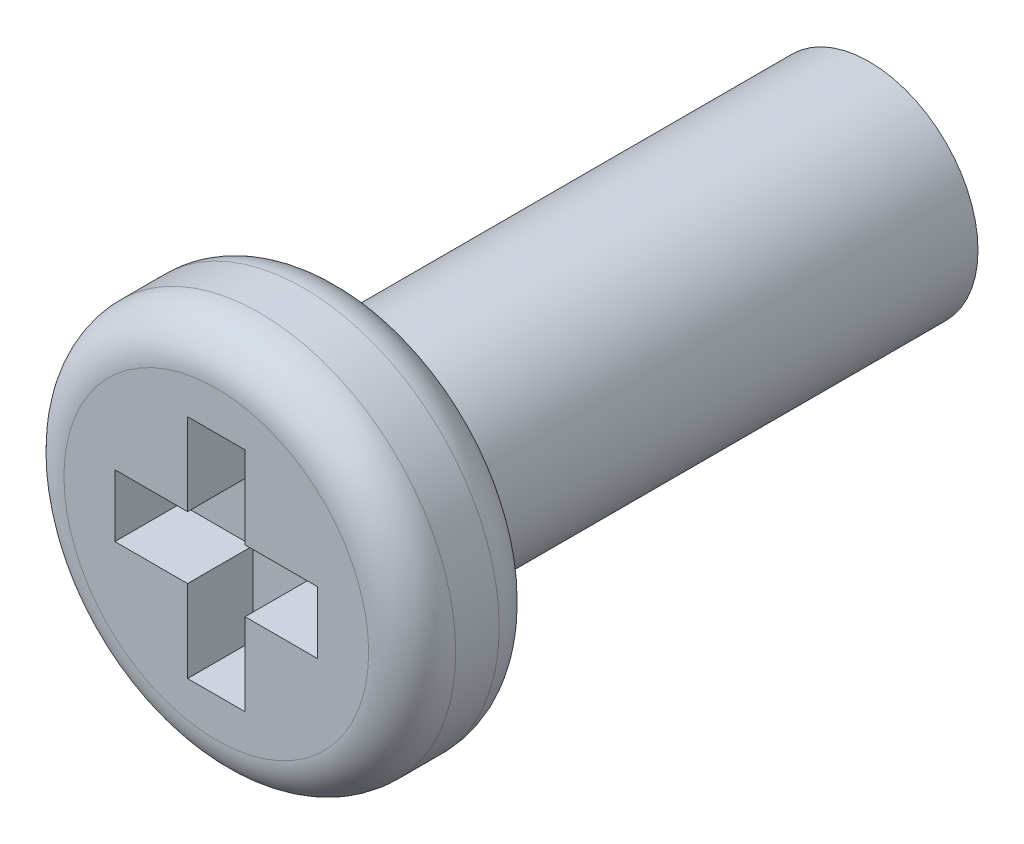
ISO-10303-21;
HEADER;
FILE_DESCRIPTION(('STEP AP214'),'2;1');
FILE_NAME('part.step','',(''),(''),'','','');
FILE_SCHEMA(('AUTOMOTIVE_DESIGN { 1 0 10303 214 1 1 1 1 }'));
ENDSEC;
DATA;
#1=APPLICATION_CONTEXT('core data for automotive mechanical design processes');
#2=APPLICATION_PROTOCOL_DEFINITION('international standard','automotive_design',2000,#1);
#3=PRODUCT_CONTEXT('',#1,'mechanical');
#4=PRODUCT('Part','Part','',(#3));
#5=PRODUCT_RELATED_PRODUCT_CATEGORY('part','',(#4));
#6=PRODUCT_DEFINITION_FORMATION('','',#4);
#7=PRODUCT_DEFINITION_CONTEXT('part definition',#1,'design');
#8=PRODUCT_DEFINITION('design','',#6,#7);
#9=PRODUCT_DEFINITION_SHAPE('','',#8);
#10=(LENGTH_UNIT() NAMED_UNIT(*) SI_UNIT(.MILLI.,.METRE.));
#11=(NAMED_UNIT(*) PLANE_ANGLE_UNIT() SI_UNIT($,.RADIAN.));
#12=(NAMED_UNIT(*) SI_UNIT($,.STERADIAN.) SOLID_ANGLE_UNIT());
#13=UNCERTAINTY_MEASURE_WITH_UNIT(LENGTH_MEASURE(1.E-05),#10,'distance_accuracy_value','');
#14=(GEOMETRIC_REPRESENTATION_CONTEXT(3) GLOBAL_UNCERTAINTY_ASSIGNED_CONTEXT((#13)) GLOBAL_UNIT_ASSIGNED_CONTEXT((#10,
#11,#12)) REPRESENTATION_CONTEXT('',''));
#15=CARTESIAN_POINT('',(0.,0.,0.));
#16=DIRECTION('',(0.,0.,1.));
#17=DIRECTION('',(1.,0.,0.));
#18=AXIS2_PLACEMENT_3D('',#15,#16,#17);
#19=CARTESIAN_POINT('',(-102.7186651452,-27.98826742742,65.3));
#20=DIRECTION('',(0.,0.,1.));
#21=DIRECTION('',(0.,1.,0.));
#22=AXIS2_PLACEMENT_3D('',#19,#20,#21);
#23=PLANE('',#22);
#24=DIRECTION('',(1.,0.,0.));
#25=VECTOR('',#24,1.);
#26=CARTESIAN_POINT('',(-106.6368651452,-25.99406742742,65.3));
#27=LINE('',#26,#25);
#28=CARTESIAN_POINT('',(-107.4718651452,-25.99406742742,65.3));
#29=VERTEX_POINT('',#28);
#30=CARTESIAN_POINT('',(-105.8018651452,-25.99406742742,65.3));
#31=VERTEX_POINT('',#30);
#32=EDGE_CURVE('E137',#29,#31,#27,.T.);
#33=ORIENTED_EDGE('',*,*,#32,.T.);
#34=DIRECTION('',(0.,-1.,0.));
#35=VECTOR('',#34,1.);
#36=CARTESIAN_POINT('',(-105.8018651452,-26.93906742742,65.3));
#37=LINE('',#36,#35);
#38=CARTESIAN_POINT('',(-105.8018651452,-27.88406742742,65.3));
#39=VERTEX_POINT('',#38);
#40=EDGE_CURVE('E119',#31,#39,#37,.T.);
#41=ORIENTED_EDGE('',*,*,#40,.T.);
#42=DIRECTION('',(1.,0.,0.));
#43=VECTOR('',#42,1.);
#44=CARTESIAN_POINT('',(-105.1418651452,-27.88406742742,65.3));
#45=LINE('',#44,#43);
#46=CARTESIAN_POINT('',(-104.4818651452,-27.88406742742,65.3));
#47=VERTEX_POINT('',#46);
#48=EDGE_CURVE('E125',#39,#47,#45,.T.);
#49=ORIENTED_EDGE('',*,*,#48,.T.);
#50=DIRECTION('',(0.,1.,0.));
#51=VECTOR('',#50,1.);
#52=CARTESIAN_POINT('',(-104.4818651452,-26.93906742742,65.3));
#53=LINE('',#52,#51);
#54=CARTESIAN_POINT('',(-104.4818651452,-25.99406742742,65.3));
#55=VERTEX_POINT('',#54);
#56=EDGE_CURVE('E261',#47,#55,#53,.T.);
#57=ORIENTED_EDGE('',*,*,#56,.T.);
#58=DIRECTION('',(1.,0.,0.));
#59=VECTOR('',#58,1.);
#60=CARTESIAN_POINT('',(-103.6468651452,-25.99406742742,65.3));
#61=LINE('',#60,#59);
#62=CARTESIAN_POINT('',(-102.8118651452,-25.99406742742,65.3));
#63=VERTEX_POINT('',#62);
#64=EDGE_CURVE('E267',#55,#63,#61,.T.);
#65=ORIENTED_EDGE('',*,*,#64,.T.);
#66=DIRECTION('',(0.,1.,0.));
#67=VECTOR('',#66,1.);
#68=CARTESIAN_POINT('',(-102.8118651452,-25.27906742742,65.3));
#69=LINE('',#68,#67);
#70=CARTESIAN_POINT('',(-102.8118651452,-24.56406742742,65.3));
#71=VERTEX_POINT('',#70);
#72=EDGE_CURVE('E273',#63,#71,#69,.T.);
#73=ORIENTED_EDGE('',*,*,#72,.T.);
#74=DIRECTION('',(-1.,0.,0.));
#75=VECTOR('',#74,1.);
#76=CARTESIAN_POINT('',(-103.6468651452,-24.56406742742,65.3));
#77=LINE('',#76,#75);
#78=CARTESIAN_POINT('',(-104.4818651452,-24.56406742742,65.3));
#79=VERTEX_POINT('',#78);
#80=EDGE_CURVE('E279',#71,#79,#77,.T.);
#81=ORIENTED_EDGE('',*,*,#80,.T.);
#82=DIRECTION('',(0.,1.,0.));
#83=VECTOR('',#82,1.);
#84=CARTESIAN_POINT('',(-104.4818651452,-23.61906742742,65.3));
#85=LINE('',#84,#83);
#86=CARTESIAN_POINT('',(-104.4818651452,-22.67406742742,65.3));
#87=VERTEX_POINT('',#86);
#88=EDGE_CURVE('E285',#79,#87,#85,.T.);
#89=ORIENTED_EDGE('',*,*,#88,.T.);
#90=DIRECTION('',(-1.,0.,0.));
#91=VECTOR('',#90,1.);
#92=CARTESIAN_POINT('',(-105.1418651452,-22.67406742742,65.3));
#93=LINE('',#92,#91);
#94=CARTESIAN_POINT('',(-105.8018651452,-22.67406742742,65.3));
#95=VERTEX_POINT('',#94);
#96=EDGE_CURVE('E291',#87,#95,#93,.T.);
#97=ORIENTED_EDGE('',*,*,#96,.T.);
#98=DIRECTION('',(0.,-1.,0.));
#99=VECTOR('',#98,1.);
#100=CARTESIAN_POINT('',(-105.8018651452,-23.61906742742,65.3));
#101=LINE('',#100,#99);
#102=CARTESIAN_POINT('',(-105.8018651452,-24.56406742742,65.3));
#103=VERTEX_POINT('',#102);
#104=EDGE_CURVE('E297',#95,#103,#101,.T.);
#105=ORIENTED_EDGE('',*,*,#104,.T.);
#106=DIRECTION('',(-1.,0.,0.));
#107=VECTOR('',#106,1.);
#108=CARTESIAN_POINT('',(-106.6368651452,-24.56406742742,65.3));
#109=LINE('',#108,#107);
#110=CARTESIAN_POINT('',(-107.4718651452,-24.56406742742,65.3));
#111=VERTEX_POINT('',#110);
#112=EDGE_CURVE('E303',#103,#111,#109,.T.);
#113=ORIENTED_EDGE('',*,*,#112,.T.);
#114=DIRECTION('',(0.,-1.,0.));
#115=VECTOR('',#114,1.);
#116=CARTESIAN_POINT('',(-107.4718651452,-25.27906742742,65.3));
#117=LINE('',#116,#115);
#118=EDGE_CURVE('E309',#111,#29,#117,.T.);
#119=ORIENTED_EDGE('',*,*,#118,.T.);
#120=EDGE_LOOP('',(#33,#41,#49,#57,#65,#73,#81,#89,#97,#105,#113,#119));
#121=FACE_BOUND('',#120,.T.);
#122=ADVANCED_FACE('F17',(#121),#23,.T.);
#123=CARTESIAN_POINT('',(-105.8282651452,-27.88406742742,65.27));
#124=DIRECTION('',(0.,-1.,0.));
#125=DIRECTION('',(1.,0.,0.));
#126=AXIS2_PLACEMENT_3D('',#123,#124,#125);
#127=PLANE('',#126);
#128=ORIENTED_EDGE('',*,*,#48,.F.);
#129=DIRECTION('',(0.,0.,1.));
#130=VECTOR('',#129,1.);
#131=CARTESIAN_POINT('',(-105.8018651452,-27.88406742742,66.05));
#132=LINE('',#131,#130);
#133=CARTESIAN_POINT('',(-105.8018651452,-27.8840674274207,66.8));
#134=VERTEX_POINT('',#133);
#135=EDGE_CURVE('E128',#39,#134,#132,.T.);
#136=ORIENTED_EDGE('',*,*,#135,.T.);
#137=DIRECTION('',(-1.,0.,0.));
#138=VECTOR('',#137,1.);
#139=CARTESIAN_POINT('',(-105.1418651452,-27.8840674274228,66.8));
#140=LINE('',#139,#138);
#141=CARTESIAN_POINT('',(-104.4818651452,-27.8840674274207,66.8));
#142=VERTEX_POINT('',#141);
#143=EDGE_CURVE('E260',#142,#134,#140,.T.);
#144=ORIENTED_EDGE('',*,*,#143,.F.);
#145=DIRECTION('',(0.,0.,-1.));
#146=VECTOR('',#145,1.);
#147=CARTESIAN_POINT('',(-104.4818651452,-27.88406742742,66.05));
#148=LINE('',#147,#146);
#149=EDGE_CURVE('E130',#142,#47,#148,.T.);
#150=ORIENTED_EDGE('',*,*,#149,.T.);
#151=EDGE_LOOP('',(#128,#136,#144,#150));
#152=FACE_BOUND('',#151,.T.);
#153=ADVANCED_FACE('F126',(#152),#127,.F.);
#154=CARTESIAN_POINT('',(-105.8018651452,-25.95626742742,65.27));
#155=DIRECTION('',(-1.,0.,0.));
#156=DIRECTION('',(0.,-1.,0.));
#157=AXIS2_PLACEMENT_3D('',#154,#155,#156);
#158=PLANE('',#157);
#159=ORIENTED_EDGE('',*,*,#40,.F.);
#160=DIRECTION('',(0.,0.,1.));
#161=VECTOR('',#160,1.);
#162=CARTESIAN_POINT('',(-105.8018651452,-25.99406742742,66.05));
#163=LINE('',#162,#161);
#164=CARTESIAN_POINT('',(-105.8018651452,-25.9940674274202,66.8));
#165=VERTEX_POINT('',#164);
#166=EDGE_CURVE('E311',#31,#165,#163,.T.);
#167=ORIENTED_EDGE('',*,*,#166,.T.);
#168=DIRECTION('',(0.,1.,0.));
#169=VECTOR('',#168,1.);
#170=CARTESIAN_POINT('',(-105.8018651452,-25.27906742742,66.8));
#171=LINE('',#170,#169);
#172=EDGE_CURVE('E136',#134,#165,#171,.T.);
#173=ORIENTED_EDGE('',*,*,#172,.F.);
#174=ORIENTED_EDGE('',*,*,#135,.F.);
#175=EDGE_LOOP('',(#159,#167,#173,#174));
#176=FACE_BOUND('',#175,.T.);
#177=ADVANCED_FACE('F135',(#176),#158,.F.);
#178=CARTESIAN_POINT('',(-107.5052651452,-25.99406742742,65.27));
#179=DIRECTION('',(0.,-1.,0.));
#180=DIRECTION('',(1.,0.,0.));
#181=AXIS2_PLACEMENT_3D('',#178,#179,#180);
#182=PLANE('',#181);
#183=ORIENTED_EDGE('',*,*,#32,.F.);
#184=DIRECTION('',(0.,0.,1.));
#185=VECTOR('',#184,1.);
#186=CARTESIAN_POINT('',(-107.4718651452,-25.99406742742,66.05));
#187=LINE('',#186,#185);
#188=CARTESIAN_POINT('',(-107.4718651452,-25.9940674274202,66.8));
#189=VERTEX_POINT('',#188);
#190=EDGE_CURVE('E306',#29,#189,#187,.T.);
#191=ORIENTED_EDGE('',*,*,#190,.T.);
#192=DIRECTION('',(-1.,0.,0.));
#193=VECTOR('',#192,1.);
#194=CARTESIAN_POINT('',(-105.1418651452,-25.9940674274208,66.8));
#195=LINE('',#194,#193);
#196=EDGE_CURVE('E314',#165,#189,#195,.T.);
#197=ORIENTED_EDGE('',*,*,#196,.F.);
#198=ORIENTED_EDGE('',*,*,#166,.F.);
#199=EDGE_LOOP('',(#183,#191,#197,#198));
#200=FACE_BOUND('',#199,.T.);
#201=ADVANCED_FACE('F315',(#200),#182,.F.);
#202=CARTESIAN_POINT('',(-107.4718651452,-24.53546742742,65.27));
#203=DIRECTION('',(-1.,0.,0.));
#204=DIRECTION('',(0.,-1.,0.));
#205=AXIS2_PLACEMENT_3D('',#202,#203,#204);
#206=PLANE('',#205);
#207=ORIENTED_EDGE('',*,*,#118,.F.);
#208=DIRECTION('',(0.,0.,1.));
#209=VECTOR('',#208,1.);
#210=CARTESIAN_POINT('',(-107.4718651452,-24.56406742742,66.05));
#211=LINE('',#210,#209);
#212=CARTESIAN_POINT('',(-107.4718651452,-24.5640674274198,66.8));
#213=VERTEX_POINT('',#212);
#214=EDGE_CURVE('E300',#111,#213,#211,.T.);
#215=ORIENTED_EDGE('',*,*,#214,.T.);
#216=DIRECTION('',(0.,1.,0.));
#217=VECTOR('',#216,1.);
#218=CARTESIAN_POINT('',(-107.4718651452,-25.27906742742,66.8));
#219=LINE('',#218,#217);
#220=EDGE_CURVE('E318',#189,#213,#219,.T.);
#221=ORIENTED_EDGE('',*,*,#220,.F.);
#222=ORIENTED_EDGE('',*,*,#190,.F.);
#223=EDGE_LOOP('',(#207,#215,#221,#222));
#224=FACE_BOUND('',#223,.T.);
#225=ADVANCED_FACE('F368',(#224),#206,.F.);
#226=CARTESIAN_POINT('',(-105.7684651452,-24.56406742742,65.27));
#227=DIRECTION('',(0.,1.,0.));
#228=DIRECTION('',(-1.,0.,0.));
#229=AXIS2_PLACEMENT_3D('',#226,#227,#228);
#230=PLANE('',#229);
#231=ORIENTED_EDGE('',*,*,#112,.F.);
#232=DIRECTION('',(0.,0.,1.));
#233=VECTOR('',#232,1.);
#234=CARTESIAN_POINT('',(-105.8018651452,-24.56406742742,66.05));
#235=LINE('',#234,#233);
#236=CARTESIAN_POINT('',(-105.8018651452,-24.5640674274198,66.8));
#237=VERTEX_POINT('',#236);
#238=EDGE_CURVE('E294',#103,#237,#235,.T.);
#239=ORIENTED_EDGE('',*,*,#238,.T.);
#240=DIRECTION('',(1.,0.,0.));
#241=VECTOR('',#240,1.);
#242=CARTESIAN_POINT('',(-105.1418651452,-24.5640674274192,66.8));
#243=LINE('',#242,#241);
#244=EDGE_CURVE('E320',#213,#237,#243,.T.);
#245=ORIENTED_EDGE('',*,*,#244,.F.);
#246=ORIENTED_EDGE('',*,*,#214,.F.);
#247=EDGE_LOOP('',(#231,#239,#245,#246));
#248=FACE_BOUND('',#247,.T.);
#249=ADVANCED_FACE('F345',(#248),#230,.F.);
#250=CARTESIAN_POINT('',(-105.8018651452,-22.63626742742,65.27));
#251=DIRECTION('',(-1.,0.,0.));
#252=DIRECTION('',(0.,-1.,0.));
#253=AXIS2_PLACEMENT_3D('',#250,#251,#252);
#254=PLANE('',#253);
#255=ORIENTED_EDGE('',*,*,#104,.F.);
#256=DIRECTION('',(0.,0.,1.));
#257=VECTOR('',#256,1.);
#258=CARTESIAN_POINT('',(-105.8018651452,-22.67406742742,66.05));
#259=LINE('',#258,#257);
#260=CARTESIAN_POINT('',(-105.8018651452,-22.6740674274193,66.8));
#261=VERTEX_POINT('',#260);
#262=EDGE_CURVE('E288',#95,#261,#259,.T.);
#263=ORIENTED_EDGE('',*,*,#262,.T.);
#264=DIRECTION('',(0.,1.,0.));
#265=VECTOR('',#264,1.);
#266=CARTESIAN_POINT('',(-105.8018651452,-25.27906742742,66.8));
#267=LINE('',#266,#265);
#268=EDGE_CURVE('E339',#237,#261,#267,.T.);
#269=ORIENTED_EDGE('',*,*,#268,.F.);
#270=ORIENTED_EDGE('',*,*,#238,.F.);
#271=EDGE_LOOP('',(#255,#263,#269,#270));
#272=FACE_BOUND('',#271,.T.);
#273=ADVANCED_FACE('F347',(#272),#254,.F.);
#274=CARTESIAN_POINT('',(-104.4554651452,-22.67406742742,65.27));
#275=DIRECTION('',(0.,1.,0.));
#276=DIRECTION('',(-1.,0.,0.));
#277=AXIS2_PLACEMENT_3D('',#274,#275,#276);
#278=PLANE('',#277);
#279=ORIENTED_EDGE('',*,*,#96,.F.);
#280=DIRECTION('',(0.,0.,1.));
#281=VECTOR('',#280,1.);
#282=CARTESIAN_POINT('',(-104.4818651452,-22.67406742742,66.05));
#283=LINE('',#282,#281);
#284=CARTESIAN_POINT('',(-104.4818651452,-22.6740674274193,66.8));
#285=VERTEX_POINT('',#284);
#286=EDGE_CURVE('E282',#87,#285,#283,.T.);
#287=ORIENTED_EDGE('',*,*,#286,.T.);
#288=DIRECTION('',(1.,0.,0.));
#289=VECTOR('',#288,1.);
#290=CARTESIAN_POINT('',(-105.1418651452,-22.6740674274171,66.8));
#291=LINE('',#290,#289);
#292=EDGE_CURVE('E337',#261,#285,#291,.T.);
#293=ORIENTED_EDGE('',*,*,#292,.F.);
#294=ORIENTED_EDGE('',*,*,#262,.F.);
#295=EDGE_LOOP('',(#279,#287,#293,#294));
#296=FACE_BOUND('',#295,.T.);
#297=ADVANCED_FACE('F351',(#296),#278,.F.);
#298=CARTESIAN_POINT('',(-104.4818651452,-24.60186742742,65.27));
#299=DIRECTION('',(1.,0.,0.));
#300=DIRECTION('',(0.,1.,0.));
#301=AXIS2_PLACEMENT_3D('',#298,#299,#300);
#302=PLANE('',#301);
#303=ORIENTED_EDGE('',*,*,#88,.F.);
#304=DIRECTION('',(0.,0.,1.));
#305=VECTOR('',#304,1.);
#306=CARTESIAN_POINT('',(-104.4818651452,-24.56406742742,66.05));
#307=LINE('',#306,#305);
#308=CARTESIAN_POINT('',(-104.4818651452,-24.5640674274198,66.8));
#309=VERTEX_POINT('',#308);
#310=EDGE_CURVE('E276',#79,#309,#307,.T.);
#311=ORIENTED_EDGE('',*,*,#310,.T.);
#312=DIRECTION('',(0.,-1.,0.));
#313=VECTOR('',#312,1.);
#314=CARTESIAN_POINT('',(-104.4818651452,-25.27906742742,66.8));
#315=LINE('',#314,#313);
#316=EDGE_CURVE('E335',#285,#309,#315,.T.);
#317=ORIENTED_EDGE('',*,*,#316,.F.);
#318=ORIENTED_EDGE('',*,*,#286,.F.);
#319=EDGE_LOOP('',(#303,#311,#317,#318));
#320=FACE_BOUND('',#319,.T.);
#321=ADVANCED_FACE('F357',(#320),#302,.F.);
#322=CARTESIAN_POINT('',(-102.7784651452,-24.56406742742,65.27));
#323=DIRECTION('',(0.,1.,0.));
#324=DIRECTION('',(-1.,0.,0.));
#325=AXIS2_PLACEMENT_3D('',#322,#323,#324);
#326=PLANE('',#325);
#327=ORIENTED_EDGE('',*,*,#80,.F.);
#328=DIRECTION('',(0.,0.,1.));
#329=VECTOR('',#328,1.);
#330=CARTESIAN_POINT('',(-102.8118651452,-24.56406742742,66.05));
#331=LINE('',#330,#329);
#332=CARTESIAN_POINT('',(-102.8118651452,-24.5640674274198,66.8));
#333=VERTEX_POINT('',#332);
#334=EDGE_CURVE('E270',#71,#333,#331,.T.);
#335=ORIENTED_EDGE('',*,*,#334,.T.);
#336=DIRECTION('',(1.,0.,0.));
#337=VECTOR('',#336,1.);
#338=CARTESIAN_POINT('',(-105.1418651452,-24.5640674274192,66.8));
#339=LINE('',#338,#337);
#340=EDGE_CURVE('E331',#309,#333,#339,.T.);
#341=ORIENTED_EDGE('',*,*,#340,.F.);
#342=ORIENTED_EDGE('',*,*,#310,.F.);
#343=EDGE_LOOP('',(#327,#335,#341,#342));
#344=FACE_BOUND('',#343,.T.);
#345=ADVANCED_FACE('F359',(#344),#326,.F.);
#346=CARTESIAN_POINT('',(-102.8118651452,-26.02266742742,65.27));
#347=DIRECTION('',(1.,0.,0.));
#348=DIRECTION('',(0.,1.,0.));
#349=AXIS2_PLACEMENT_3D('',#346,#347,#348);
#350=PLANE('',#349);
#351=ORIENTED_EDGE('',*,*,#72,.F.);
#352=DIRECTION('',(0.,0.,1.));
#353=VECTOR('',#352,1.);
#354=CARTESIAN_POINT('',(-102.8118651452,-25.99406742742,66.05));
#355=LINE('',#354,#353);
#356=CARTESIAN_POINT('',(-102.8118651452,-25.9940674274202,66.8));
#357=VERTEX_POINT('',#356);
#358=EDGE_CURVE('E264',#63,#357,#355,.T.);
#359=ORIENTED_EDGE('',*,*,#358,.T.);
#360=DIRECTION('',(0.,-1.,0.));
#361=VECTOR('',#360,1.);
#362=CARTESIAN_POINT('',(-102.8118651452,-25.27906742742,66.8));
#363=LINE('',#362,#361);
#364=EDGE_CURVE('E330',#333,#357,#363,.T.);
#365=ORIENTED_EDGE('',*,*,#364,.F.);
#366=ORIENTED_EDGE('',*,*,#334,.F.);
#367=EDGE_LOOP('',(#351,#359,#365,#366));
#368=FACE_BOUND('',#367,.T.);
#369=ADVANCED_FACE('F363',(#368),#350,.F.);
#370=CARTESIAN_POINT('',(-104.5152651452,-25.99406742742,65.27));
#371=DIRECTION('',(0.,-1.,0.));
#372=DIRECTION('',(1.,0.,0.));
#373=AXIS2_PLACEMENT_3D('',#370,#371,#372);
#374=PLANE('',#373);
#375=ORIENTED_EDGE('',*,*,#64,.F.);
#376=DIRECTION('',(0.,0.,1.));
#377=VECTOR('',#376,1.);
#378=CARTESIAN_POINT('',(-104.4818651452,-25.99406742742,66.05));
#379=LINE('',#378,#377);
#380=CARTESIAN_POINT('',(-104.4818651452,-25.9940674274202,66.8));
#381=VERTEX_POINT('',#380);
#382=EDGE_CURVE('E252',#55,#381,#379,.T.);
#383=ORIENTED_EDGE('',*,*,#382,.T.);
#384=DIRECTION('',(-1.,0.,0.));
#385=VECTOR('',#384,1.);
#386=CARTESIAN_POINT('',(-105.1418651452,-25.9940674274208,66.8));
#387=LINE('',#386,#385);
#388=EDGE_CURVE('E327',#357,#381,#387,.T.);
#389=ORIENTED_EDGE('',*,*,#388,.F.);
#390=ORIENTED_EDGE('',*,*,#358,.F.);
#391=EDGE_LOOP('',(#375,#383,#389,#390));
#392=FACE_BOUND('',#391,.T.);
#393=ADVANCED_FACE('F366',(#392),#374,.F.);
#394=CARTESIAN_POINT('',(-104.4818651452,-27.92186742742,65.27));
#395=DIRECTION('',(1.,0.,0.));
#396=DIRECTION('',(0.,1.,0.));
#397=AXIS2_PLACEMENT_3D('',#394,#395,#396);
#398=PLANE('',#397);
#399=ORIENTED_EDGE('',*,*,#56,.F.);
#400=ORIENTED_EDGE('',*,*,#149,.F.);
#401=DIRECTION('',(0.,-1.,0.));
#402=VECTOR('',#401,1.);
#403=CARTESIAN_POINT('',(-104.4818651452,-25.27906742742,66.8));
#404=LINE('',#403,#402);
#405=EDGE_CURVE('E238',#381,#142,#404,.T.);
#406=ORIENTED_EDGE('',*,*,#405,.F.);
#407=ORIENTED_EDGE('',*,*,#382,.F.);
#408=EDGE_LOOP('',(#399,#400,#406,#407));
#409=FACE_BOUND('',#408,.T.);
#410=ADVANCED_FACE('F164',(#409),#398,.F.);
#411=CARTESIAN_POINT('',(-108.7818651452,-28.9220656459,66.8));
#412=DIRECTION('',(0.,0.,1.));
#413=DIRECTION('',(1.,0.,0.));
#414=AXIS2_PLACEMENT_3D('',#411,#412,#413);
#415=PLANE('',#414);
#416=ORIENTED_EDGE('',*,*,#388,.T.);
#417=ORIENTED_EDGE('',*,*,#405,.T.);
#418=ORIENTED_EDGE('',*,*,#143,.T.);
#419=ORIENTED_EDGE('',*,*,#172,.T.);
#420=ORIENTED_EDGE('',*,*,#196,.T.);
#421=ORIENTED_EDGE('',*,*,#220,.T.);
#422=ORIENTED_EDGE('',*,*,#244,.T.);
#423=ORIENTED_EDGE('',*,*,#268,.T.);
#424=ORIENTED_EDGE('',*,*,#292,.T.);
#425=ORIENTED_EDGE('',*,*,#316,.T.);
#426=ORIENTED_EDGE('',*,*,#340,.T.);
#427=ORIENTED_EDGE('',*,*,#364,.T.);
#428=EDGE_LOOP('',(#416,#417,#418,#419,#420,#421,#422,#423,#424,#425,#426,#427));
#429=FACE_BOUND('',#428,.T.);
#430=CARTESIAN_POINT('',(-105.1418651452,-25.27906742742,66.8));
#431=DIRECTION('',(0.,0.,-1.));
#432=DIRECTION('',(1.,-5.95357096968761E-12,0.));
#433=AXIS2_PLACEMENT_3D('',#430,#431,#432);
#434=CIRCLE('',#433,3.49999999992051);
#435=CARTESIAN_POINT('',(-108.641865145192,-25.2790674274142,66.8));
#436=VERTEX_POINT('',#435);
#437=CARTESIAN_POINT('',(-101.641865145208,-25.2790674274325,66.8));
#438=VERTEX_POINT('',#437);
#439=EDGE_CURVE('E148',#436,#438,#434,.F.);
#440=ORIENTED_EDGE('',*,*,#439,.T.);
#441=CARTESIAN_POINT('',(-105.1418651452,-25.27906742742,66.8));
#442=DIRECTION('',(0.,0.,-1.));
#443=DIRECTION('',(-1.,1.07651982565703E-12,0.));
#444=AXIS2_PLACEMENT_3D('',#441,#442,#443);
#445=CIRCLE('',#444,3.50000000002046);
#446=EDGE_CURVE('E235',#438,#436,#445,.F.);
#447=ORIENTED_EDGE('',*,*,#446,.T.);
#448=EDGE_LOOP('',(#440,#447));
#449=FACE_BOUND('',#448,.T.);
#450=ADVANCED_FACE('F154',(#429,#449),#415,.T.);
#451=CARTESIAN_POINT('',(-105.1418651452,-25.27906742742,65.8));
#452=DIRECTION('',(0.,0.,1.));
#453=DIRECTION('',(0.999977408165713,-0.00672184187424638,0.));
#454=AXIS2_PLACEMENT_3D('',#451,#452,#453);
#455=TOROIDAL_SURFACE('',#454,3.50000000002,1.);
#456=CARTESIAN_POINT('',(-105.1418651452,-25.27906742742,65.8000000000024));
#457=DIRECTION('',(0.,0.,1.));
#458=DIRECTION('',(1.,0.,0.));
#459=AXIS2_PLACEMENT_3D('',#456,#457,#458);
#460=CIRCLE('',#459,4.5);
#461=CARTESIAN_POINT('',(-100.6418651452,-25.27906742742,65.8000000000024));
#462=VERTEX_POINT('',#461);
#463=EDGE_CURVE('E232',#462,#462,#460,.T.);
#464=ORIENTED_EDGE('',*,*,#463,.T.);
#465=EDGE_LOOP('',(#464));
#466=FACE_BOUND('',#465,.T.);
#467=ORIENTED_EDGE('',*,*,#439,.F.);
#468=ORIENTED_EDGE('',*,*,#446,.F.);
#469=EDGE_LOOP('',(#467,#468));
#470=FACE_BOUND('',#469,.T.);
#471=ADVANCED_FACE('F163',(#466,#470),#455,.T.);
#472=CARTESIAN_POINT('',(-105.1418651452,-25.27906742742,64.7999999999976));
#473=DIRECTION('',(0.,0.,1.));
#474=DIRECTION('',(0.,-1.,0.));
#475=AXIS2_PLACEMENT_3D('',#472,#473,#474);
#476=CYLINDRICAL_SURFACE('',#475,4.5);
#477=CARTESIAN_POINT('',(-105.1418651452,-25.27906742742,64.8));
#478=DIRECTION('',(0.,0.,1.));
#479=DIRECTION('',(-0.999954410342659,-0.009548677199735,0.));
#480=AXIS2_PLACEMENT_3D('',#477,#478,#479);
#481=CIRCLE('',#480,4.50000000000072);
#482=CARTESIAN_POINT('',(-109.641659991743,-25.3220364748188,64.8));
#483=VERTEX_POINT('',#482);
#484=EDGE_CURVE('E198',#483,#483,#481,.T.);
#485=ORIENTED_EDGE('',*,*,#484,.T.);
#486=EDGE_LOOP('',(#485));
#487=FACE_BOUND('',#486,.T.);
#488=ORIENTED_EDGE('',*,*,#463,.F.);
#489=EDGE_LOOP('',(#488));
#490=FACE_BOUND('',#489,.T.);
#491=ADVANCED_FACE('F217',(#487,#490),#476,.T.);
#492=CARTESIAN_POINT('',(-107.7418651452,-22.67646240967,51.8));
#493=DIRECTION('',(0.,0.,-1.));
#494=DIRECTION('',(1.,0.,0.));
#495=AXIS2_PLACEMENT_3D('',#492,#493,#494);
#496=PLANE('',#495);
#497=CARTESIAN_POINT('',(-105.1418651452,-25.27906742742,51.8));
#498=DIRECTION('',(0.,0.,-1.));
#499=DIRECTION('',(-1.,0.,0.));
#500=AXIS2_PLACEMENT_3D('',#497,#498,#499);
#501=CIRCLE('',#500,2.5);
#502=CARTESIAN_POINT('',(-107.6418651452,-25.27906742742,51.8));
#503=VERTEX_POINT('',#502);
#504=EDGE_CURVE('E195',#503,#503,#501,.T.);
#505=ORIENTED_EDGE('',*,*,#504,.T.);
#506=EDGE_LOOP('',(#505));
#507=FACE_BOUND('',#506,.T.);
#508=ADVANCED_FACE('F167',(#507),#496,.T.);
#509=CARTESIAN_POINT('',(-105.1418651452,-25.27906742742,64.8));
#510=DIRECTION('',(0.,0.,1.));
#511=DIRECTION('',(-0.999954410342657,-0.0095486771999976,0.));
#512=AXIS2_PLACEMENT_3D('',#509,#510,#511);
#513=TOROIDAL_SURFACE('',#512,3.50000000000071,1.);
#514=ORIENTED_EDGE('',*,*,#484,.F.);
#515=EDGE_LOOP('',(#514));
#516=FACE_BOUND('',#515,.T.);
#517=CARTESIAN_POINT('',(-105.1418651452,-25.27906742742,63.8));
#518=DIRECTION('',(0.,0.,1.));
#519=DIRECTION('',(-1.,-1.42049070918529E-12,0.));
#520=AXIS2_PLACEMENT_3D('',#517,#518,#519);
#521=CIRCLE('',#520,3.50000000000072);
#522=CARTESIAN_POINT('',(-108.6418651452,-25.2790674274365,63.8));
#523=VERTEX_POINT('',#522);
#524=CARTESIAN_POINT('',(-101.6418651452,-25.2790674274103,63.8));
#525=VERTEX_POINT('',#524);
#526=EDGE_CURVE('E178',#523,#525,#521,.T.);
#527=ORIENTED_EDGE('',*,*,#526,.T.);
#528=CARTESIAN_POINT('',(-105.1418651452,-25.27906742742,63.8));
#529=DIRECTION('',(0.,0.,1.));
#530=DIRECTION('',(1.,1.40859546249288E-12,0.));
#531=AXIS2_PLACEMENT_3D('',#528,#529,#530);
#532=CIRCLE('',#531,3.50000000000072);
#533=EDGE_CURVE('E30',#525,#523,#532,.T.);
#534=ORIENTED_EDGE('',*,*,#533,.T.);
#535=EDGE_LOOP('',(#527,#534));
#536=FACE_BOUND('',#535,.T.);
#537=ADVANCED_FACE('F204',(#516,#536),#513,.T.);
#538=CARTESIAN_POINT('',(-105.1418651452,-25.27906742742,63.8));
#539=DIRECTION('',(0.,0.,-1.));
#540=DIRECTION('',(-1.,0.,0.));
#541=AXIS2_PLACEMENT_3D('',#538,#539,#540);
#542=CYLINDRICAL_SURFACE('',#541,2.5);
#543=ORIENTED_EDGE('',*,*,#504,.F.);
#544=EDGE_LOOP('',(#543));
#545=FACE_BOUND('',#544,.T.);
#546=CARTESIAN_POINT('',(-105.1418651452,-25.27906742742,63.8));
#547=DIRECTION('',(0.,0.,-1.));
#548=DIRECTION('',(-1.,0.,0.));
#549=AXIS2_PLACEMENT_3D('',#546,#547,#548);
#550=CIRCLE('',#549,2.5);
#551=CARTESIAN_POINT('',(-107.6418651452,-25.27906742742,63.8));
#552=VERTEX_POINT('',#551);
#553=EDGE_CURVE('E11',#552,#552,#550,.T.);
#554=ORIENTED_EDGE('',*,*,#553,.T.);
#555=EDGE_LOOP('',(#554));
#556=FACE_BOUND('',#555,.T.);
#557=ADVANCED_FACE('F215',(#545,#556),#542,.T.);
#558=CARTESIAN_POINT('',(-108.7818651452,-28.9220656459,63.8));
#559=DIRECTION('',(0.,0.,1.));
#560=DIRECTION('',(1.,0.,0.));
#561=AXIS2_PLACEMENT_3D('',#558,#559,#560);
#562=PLANE('',#561);
#563=ORIENTED_EDGE('',*,*,#553,.F.);
#564=EDGE_LOOP('',(#563));
#565=FACE_BOUND('',#564,.T.);
#566=ORIENTED_EDGE('',*,*,#526,.F.);
#567=ORIENTED_EDGE('',*,*,#533,.F.);
#568=EDGE_LOOP('',(#566,#567));
#569=FACE_BOUND('',#568,.T.);
#570=ADVANCED_FACE('F19',(#565,#569),#562,.F.);
#571=CLOSED_SHELL('',(#122,#153,#177,#201,#225,#249,#273,#297,#321,#345,#369,#393,#410,#450,
#471,#491,#508,#537,#557,#570));
#572=MANIFOLD_SOLID_BREP('B1',#571);
#573=ADVANCED_BREP_SHAPE_REPRESENTATION('',(#18,#572),#14);
#574=SHAPE_DEFINITION_REPRESENTATION(#9,#573);
ENDSEC;
END-ISO-10303-21;
